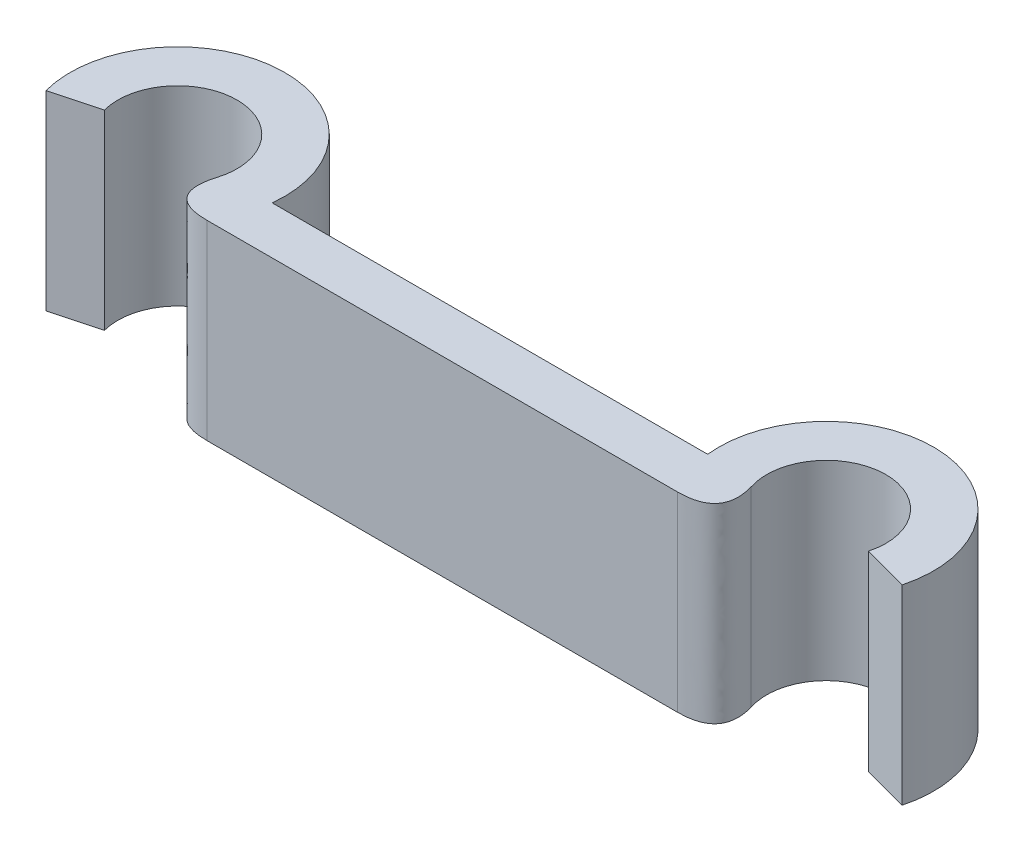
ISO-10303-21;
HEADER;
FILE_DESCRIPTION(('STEP AP214'),'2;1');
FILE_NAME('part.step','',(''),(''),'','','');
FILE_SCHEMA(('AUTOMOTIVE_DESIGN { 1 0 10303 214 1 1 1 1 }'));
ENDSEC;
DATA;
#1=APPLICATION_CONTEXT('core data for automotive mechanical design processes');
#2=APPLICATION_PROTOCOL_DEFINITION('international standard','automotive_design',2000,#1);
#3=PRODUCT_CONTEXT('',#1,'mechanical');
#4=PRODUCT('Part','Part','',(#3));
#5=PRODUCT_RELATED_PRODUCT_CATEGORY('part','',(#4));
#6=PRODUCT_DEFINITION_FORMATION('','',#4);
#7=PRODUCT_DEFINITION_CONTEXT('part definition',#1,'design');
#8=PRODUCT_DEFINITION('design','',#6,#7);
#9=PRODUCT_DEFINITION_SHAPE('','',#8);
#10=(LENGTH_UNIT() NAMED_UNIT(*) SI_UNIT(.MILLI.,.METRE.));
#11=(NAMED_UNIT(*) PLANE_ANGLE_UNIT() SI_UNIT($,.RADIAN.));
#12=(NAMED_UNIT(*) SI_UNIT($,.STERADIAN.) SOLID_ANGLE_UNIT());
#13=UNCERTAINTY_MEASURE_WITH_UNIT(LENGTH_MEASURE(1.E-05),#10,'distance_accuracy_value','');
#14=(GEOMETRIC_REPRESENTATION_CONTEXT(3) GLOBAL_UNCERTAINTY_ASSIGNED_CONTEXT((#13)) GLOBAL_UNIT_ASSIGNED_CONTEXT((#10,
#11,#12)) REPRESENTATION_CONTEXT('',''));
#15=CARTESIAN_POINT('',(0.,0.,0.));
#16=DIRECTION('',(0.,0.,1.));
#17=DIRECTION('',(1.,0.,0.));
#18=AXIS2_PLACEMENT_3D('',#15,#16,#17);
#19=CARTESIAN_POINT('',(0.,10.,0.625));
#20=DIRECTION('',(0.,0.,1.));
#21=DIRECTION('',(1.,0.,0.));
#22=AXIS2_PLACEMENT_3D('',#19,#20,#21);
#23=PLANE('',#22);
#24=DIRECTION('',(-1.,0.,0.));
#25=VECTOR('',#24,1.);
#26=CARTESIAN_POINT('',(0.,0.,0.625));
#27=LINE('',#26,#25);
#28=CARTESIAN_POINT('',(11.4098300562505,0.,0.625000000000001));
#29=VERTEX_POINT('',#28);
#30=CARTESIAN_POINT('',(-11.4098300562505,0.,0.625000000000001));
#31=VERTEX_POINT('',#30);
#32=EDGE_CURVE('E141',#29,#31,#27,.T.);
#33=ORIENTED_EDGE('',*,*,#32,.T.);
#34=DIRECTION('',(0.,-1.,0.));
#35=VECTOR('',#34,1.);
#36=CARTESIAN_POINT('',(-11.4098300562505,10.,0.625000000000001));
#37=LINE('',#36,#35);
#38=CARTESIAN_POINT('',(-11.4098300562505,10.,0.625000000000001));
#39=VERTEX_POINT('',#38);
#40=EDGE_CURVE('E11',#39,#31,#37,.T.);
#41=ORIENTED_EDGE('',*,*,#40,.F.);
#42=DIRECTION('',(-1.,0.,0.));
#43=VECTOR('',#42,1.);
#44=CARTESIAN_POINT('',(0.,10.,0.625));
#45=LINE('',#44,#43);
#46=CARTESIAN_POINT('',(11.4098300562505,10.,0.625000000000001));
#47=VERTEX_POINT('',#46);
#48=EDGE_CURVE('E159',#47,#39,#45,.T.);
#49=ORIENTED_EDGE('',*,*,#48,.F.);
#50=DIRECTION('',(0.,-1.,0.));
#51=VECTOR('',#50,1.);
#52=CARTESIAN_POINT('',(11.4098300562505,10.,0.625000000000001));
#53=LINE('',#52,#51);
#54=EDGE_CURVE('E206',#47,#29,#53,.T.);
#55=ORIENTED_EDGE('',*,*,#54,.T.);
#56=EDGE_LOOP('',(#33,#41,#49,#55));
#57=FACE_BOUND('',#56,.T.);
#58=ADVANCED_FACE('F34',(#57),#23,.F.);
#59=CARTESIAN_POINT('',(-17.,10.,0.));
#60=DIRECTION('',(0.,-1.,0.));
#61=DIRECTION('',(0.,0.,-1.));
#62=AXIS2_PLACEMENT_3D('',#59,#60,#61);
#63=CYLINDRICAL_SURFACE('',#62,5.625);
#64=CARTESIAN_POINT('',(-17.,0.,0.));
#65=DIRECTION('',(0.,1.,0.));
#66=DIRECTION('',(0.,0.,1.));
#67=AXIS2_PLACEMENT_3D('',#64,#65,#66);
#68=CIRCLE('',#67,5.625);
#69=CARTESIAN_POINT('',(-22.433332772876,0.,1.45585712870164));
#70=VERTEX_POINT('',#69);
#71=EDGE_CURVE('E136',#31,#70,#68,.T.);
#72=ORIENTED_EDGE('',*,*,#71,.T.);
#73=DIRECTION('',(0.,-1.,0.));
#74=VECTOR('',#73,1.);
#75=CARTESIAN_POINT('',(-22.433332772876,10.,1.45585712870164));
#76=LINE('',#75,#74);
#77=CARTESIAN_POINT('',(-22.433332772876,10.,1.45585712870164));
#78=VERTEX_POINT('',#77);
#79=EDGE_CURVE('E42',#78,#70,#76,.T.);
#80=ORIENTED_EDGE('',*,*,#79,.F.);
#81=CARTESIAN_POINT('',(-17.,10.,0.));
#82=DIRECTION('',(0.,1.,0.));
#83=DIRECTION('',(0.,0.,1.));
#84=AXIS2_PLACEMENT_3D('',#81,#82,#83);
#85=CIRCLE('',#84,5.625);
#86=EDGE_CURVE('E80',#39,#78,#85,.T.);
#87=ORIENTED_EDGE('',*,*,#86,.F.);
#88=ORIENTED_EDGE('',*,*,#40,.T.);
#89=EDGE_LOOP('',(#72,#80,#87,#88));
#90=FACE_BOUND('',#89,.T.);
#91=ADVANCED_FACE('F129',(#90),#63,.T.);
#92=CARTESIAN_POINT('',(-1.13878406783222,10.,-4.24999999999991));
#93=DIRECTION('',(0.258819045102515,0.,0.96592582628907));
#94=DIRECTION('',(0.96592582628907,0.,-0.258819045102515));
#95=AXIS2_PLACEMENT_3D('',#92,#93,#94);
#96=PLANE('',#95);
#97=DIRECTION('',(-0.96592582628907,0.,0.258819045102515));
#98=VECTOR('',#97,1.);
#99=CARTESIAN_POINT('',(-1.13878406783222,0.,-4.24999999999991));
#100=LINE('',#99,#98);
#101=CARTESIAN_POINT('',(-20.0185182071533,0.,0.808809515945358));
#102=VERTEX_POINT('',#101);
#103=EDGE_CURVE('E95',#102,#70,#100,.T.);
#104=ORIENTED_EDGE('',*,*,#103,.F.);
#105=DIRECTION('',(0.,-1.,0.));
#106=VECTOR('',#105,1.);
#107=CARTESIAN_POINT('',(-20.0185182071533,10.,0.808809515945358));
#108=LINE('',#107,#106);
#109=CARTESIAN_POINT('',(-20.0185182071533,10.,0.808809515945358));
#110=VERTEX_POINT('',#109);
#111=EDGE_CURVE('E90',#110,#102,#108,.T.);
#112=ORIENTED_EDGE('',*,*,#111,.F.);
#113=DIRECTION('',(-0.96592582628907,0.,0.258819045102515));
#114=VECTOR('',#113,1.);
#115=CARTESIAN_POINT('',(-1.13878406783222,10.,-4.24999999999991));
#116=LINE('',#115,#114);
#117=EDGE_CURVE('E93',#110,#78,#116,.T.);
#118=ORIENTED_EDGE('',*,*,#117,.T.);
#119=ORIENTED_EDGE('',*,*,#79,.T.);
#120=EDGE_LOOP('',(#104,#112,#118,#119));
#121=FACE_BOUND('',#120,.T.);
#122=ADVANCED_FACE('F92',(#121),#96,.T.);
#123=CARTESIAN_POINT('',(-17.,10.,0.));
#124=DIRECTION('',(0.,-1.,0.));
#125=DIRECTION('',(0.,0.,-1.));
#126=AXIS2_PLACEMENT_3D('',#123,#124,#125);
#127=CYLINDRICAL_SURFACE('',#126,3.125);
#128=CARTESIAN_POINT('',(-17.,0.,0.));
#129=DIRECTION('',(0.,1.,0.));
#130=DIRECTION('',(0.,0.,1.));
#131=AXIS2_PLACEMENT_3D('',#128,#129,#130);
#132=CIRCLE('',#131,3.125);
#133=CARTESIAN_POINT('',(-14.0294318781231,0.,0.970231948190054));
#134=VERTEX_POINT('',#133);
#135=EDGE_CURVE('E145',#134,#102,#132,.T.);
#136=ORIENTED_EDGE('',*,*,#135,.F.);
#137=DIRECTION('',(0.,-1.,0.));
#138=VECTOR('',#137,1.);
#139=CARTESIAN_POINT('',(-14.0294318781231,10.,0.970231948190054));
#140=LINE('',#139,#138);
#141=CARTESIAN_POINT('',(-14.0294318781231,10.,0.970231948190054));
#142=VERTEX_POINT('',#141);
#143=EDGE_CURVE('E68',#142,#134,#140,.T.);
#144=ORIENTED_EDGE('',*,*,#143,.F.);
#145=CARTESIAN_POINT('',(-17.,10.,0.));
#146=DIRECTION('',(0.,1.,0.));
#147=DIRECTION('',(0.,0.,1.));
#148=AXIS2_PLACEMENT_3D('',#145,#146,#147);
#149=CIRCLE('',#148,3.125);
#150=EDGE_CURVE('E103',#142,#110,#149,.T.);
#151=ORIENTED_EDGE('',*,*,#150,.T.);
#152=ORIENTED_EDGE('',*,*,#111,.T.);
#153=EDGE_LOOP('',(#136,#144,#151,#152));
#154=FACE_BOUND('',#153,.T.);
#155=ADVANCED_FACE('F105',(#154),#127,.F.);
#156=CARTESIAN_POINT('',(-12.3229282665326,10.,3.125));
#157=CARTESIAN_POINT('',(-14.7142969629127,10.,3.13091486922471));
#158=CARTESIAN_POINT('',(-13.9814817928467,10.,0.808809515945357));
#159=B_SPLINE_CURVE_WITH_KNOTS('',2,(#156,#157,#158),.UNSPECIFIED.,.F.,.F.,(3,3),(0.,1.),.UNSPECIFIED.);
#160=DIRECTION('',(0.,-1.,0.));
#161=VECTOR('',#160,1.);
#162=SURFACE_OF_LINEAR_EXTRUSION('',#159,#161);
#163=CARTESIAN_POINT('',(-12.3229282665326,0.,3.125));
#164=CARTESIAN_POINT('',(-14.7142969629127,0.,3.13091486922471));
#165=CARTESIAN_POINT('',(-13.9814817928467,0.,0.808809515945357));
#166=B_SPLINE_CURVE_WITH_KNOTS('',2,(#163,#164,#165),.UNSPECIFIED.,.F.,.F.,(3,3),(0.,1.),.UNSPECIFIED.);
#167=CARTESIAN_POINT('',(-12.3229282665326,0.,3.125));
#168=VERTEX_POINT('',#167);
#169=EDGE_CURVE('E147',#168,#134,#166,.T.);
#170=ORIENTED_EDGE('',*,*,#169,.F.);
#171=DIRECTION('',(0.,-1.,0.));
#172=VECTOR('',#171,1.);
#173=CARTESIAN_POINT('',(-12.3229282665326,10.,3.125));
#174=LINE('',#173,#172);
#175=CARTESIAN_POINT('',(-12.3229282665326,10.,3.125));
#176=VERTEX_POINT('',#175);
#177=EDGE_CURVE('E50',#176,#168,#174,.T.);
#178=ORIENTED_EDGE('',*,*,#177,.F.);
#179=EDGE_CURVE('E106',#176,#142,#159,.T.);
#180=ORIENTED_EDGE('',*,*,#179,.T.);
#181=ORIENTED_EDGE('',*,*,#143,.T.);
#182=EDGE_LOOP('',(#170,#178,#180,#181));
#183=FACE_BOUND('',#182,.T.);
#184=ADVANCED_FACE('F120',(#183),#162,.T.);
#185=CARTESIAN_POINT('',(0.,10.,3.125));
#186=DIRECTION('',(0.,0.,1.));
#187=DIRECTION('',(1.,0.,0.));
#188=AXIS2_PLACEMENT_3D('',#185,#186,#187);
#189=PLANE('',#188);
#190=DIRECTION('',(-1.,0.,0.));
#191=VECTOR('',#190,1.);
#192=CARTESIAN_POINT('',(0.,0.,3.125));
#193=LINE('',#192,#191);
#194=CARTESIAN_POINT('',(12.3229282665326,0.,3.125));
#195=VERTEX_POINT('',#194);
#196=EDGE_CURVE('E153',#195,#168,#193,.T.);
#197=ORIENTED_EDGE('',*,*,#196,.F.);
#198=DIRECTION('',(0.,-1.,0.));
#199=VECTOR('',#198,1.);
#200=CARTESIAN_POINT('',(12.3229282665326,10.,3.125));
#201=LINE('',#200,#199);
#202=CARTESIAN_POINT('',(12.3229282665326,10.,3.125));
#203=VERTEX_POINT('',#202);
#204=EDGE_CURVE('E165',#203,#195,#201,.T.);
#205=ORIENTED_EDGE('',*,*,#204,.F.);
#206=DIRECTION('',(-1.,0.,0.));
#207=VECTOR('',#206,1.);
#208=CARTESIAN_POINT('',(0.,10.,3.125));
#209=LINE('',#208,#207);
#210=EDGE_CURVE('E108',#203,#176,#209,.T.);
#211=ORIENTED_EDGE('',*,*,#210,.T.);
#212=ORIENTED_EDGE('',*,*,#177,.T.);
#213=EDGE_LOOP('',(#197,#205,#211,#212));
#214=FACE_BOUND('',#213,.T.);
#215=ADVANCED_FACE('F124',(#214),#189,.T.);
#216=CARTESIAN_POINT('',(0.,10.,0.));
#217=DIRECTION('',(0.,1.,0.));
#218=DIRECTION('',(0.,0.,1.));
#219=AXIS2_PLACEMENT_3D('',#216,#217,#218);
#220=PLANE('',#219);
#221=ORIENTED_EDGE('',*,*,#48,.T.);
#222=ORIENTED_EDGE('',*,*,#86,.T.);
#223=ORIENTED_EDGE('',*,*,#117,.F.);
#224=ORIENTED_EDGE('',*,*,#150,.F.);
#225=ORIENTED_EDGE('',*,*,#179,.F.);
#226=ORIENTED_EDGE('',*,*,#210,.F.);
#227=CARTESIAN_POINT('',(12.3229282665326,10.,3.125));
#228=CARTESIAN_POINT('',(14.7142969629127,10.,3.13091486922471));
#229=CARTESIAN_POINT('',(13.9814817928467,10.,0.808809515945357));
#230=B_SPLINE_CURVE_WITH_KNOTS('',2,(#227,#228,#229),.UNSPECIFIED.,.F.,.F.,(3,3),(0.,1.),.UNSPECIFIED.);
#231=CARTESIAN_POINT('',(14.0294318781231,10.,0.970231948190054));
#232=VERTEX_POINT('',#231);
#233=EDGE_CURVE('E170',#203,#232,#230,.T.);
#234=ORIENTED_EDGE('',*,*,#233,.T.);
#235=CARTESIAN_POINT('',(17.,10.,0.));
#236=DIRECTION('',(0.,-1.,0.));
#237=DIRECTION('',(0.,0.,1.));
#238=AXIS2_PLACEMENT_3D('',#235,#236,#237);
#239=CIRCLE('',#238,3.125);
#240=CARTESIAN_POINT('',(20.0185182071533,10.,0.808809515945358));
#241=VERTEX_POINT('',#240);
#242=EDGE_CURVE('E218',#232,#241,#239,.T.);
#243=ORIENTED_EDGE('',*,*,#242,.T.);
#244=DIRECTION('',(0.96592582628907,0.,0.258819045102515));
#245=VECTOR('',#244,1.);
#246=CARTESIAN_POINT('',(1.13878406783222,10.,-4.24999999999991));
#247=LINE('',#246,#245);
#248=CARTESIAN_POINT('',(22.433332772876,10.,1.45585712870164));
#249=VERTEX_POINT('',#248);
#250=EDGE_CURVE('E228',#241,#249,#247,.T.);
#251=ORIENTED_EDGE('',*,*,#250,.T.);
#252=CARTESIAN_POINT('',(17.,10.,0.));
#253=DIRECTION('',(0.,-1.,0.));
#254=DIRECTION('',(0.,0.,1.));
#255=AXIS2_PLACEMENT_3D('',#252,#253,#254);
#256=CIRCLE('',#255,5.625);
#257=EDGE_CURVE('E202',#47,#249,#256,.T.);
#258=ORIENTED_EDGE('',*,*,#257,.F.);
#259=EDGE_LOOP('',(#221,#222,#223,#224,#225,#226,#234,#243,#251,#258));
#260=FACE_BOUND('',#259,.T.);
#261=ADVANCED_FACE('F102',(#260),#220,.T.);
#262=CARTESIAN_POINT('',(0.,0.,0.));
#263=DIRECTION('',(0.,1.,0.));
#264=DIRECTION('',(0.,0.,1.));
#265=AXIS2_PLACEMENT_3D('',#262,#263,#264);
#266=PLANE('',#265);
#267=ORIENTED_EDGE('',*,*,#32,.F.);
#268=CARTESIAN_POINT('',(17.,0.,0.));
#269=DIRECTION('',(0.,-1.,0.));
#270=DIRECTION('',(0.,0.,1.));
#271=AXIS2_PLACEMENT_3D('',#268,#269,#270);
#272=CIRCLE('',#271,5.625);
#273=CARTESIAN_POINT('',(22.433332772876,0.,1.45585712870164));
#274=VERTEX_POINT('',#273);
#275=EDGE_CURVE('E200',#29,#274,#272,.T.);
#276=ORIENTED_EDGE('',*,*,#275,.T.);
#277=DIRECTION('',(0.96592582628907,0.,0.258819045102515));
#278=VECTOR('',#277,1.);
#279=CARTESIAN_POINT('',(1.13878406783222,0.,-4.24999999999991));
#280=LINE('',#279,#278);
#281=CARTESIAN_POINT('',(20.0185182071533,0.,0.808809515945358));
#282=VERTEX_POINT('',#281);
#283=EDGE_CURVE('E210',#282,#274,#280,.T.);
#284=ORIENTED_EDGE('',*,*,#283,.F.);
#285=CARTESIAN_POINT('',(17.,0.,0.));
#286=DIRECTION('',(0.,-1.,0.));
#287=DIRECTION('',(0.,0.,1.));
#288=AXIS2_PLACEMENT_3D('',#285,#286,#287);
#289=CIRCLE('',#288,3.125);
#290=CARTESIAN_POINT('',(14.0294318781231,0.,0.970231948190054));
#291=VERTEX_POINT('',#290);
#292=EDGE_CURVE('E214',#291,#282,#289,.T.);
#293=ORIENTED_EDGE('',*,*,#292,.F.);
#294=CARTESIAN_POINT('',(12.3229282665326,0.,3.125));
#295=CARTESIAN_POINT('',(14.7142969629127,0.,3.13091486922471));
#296=CARTESIAN_POINT('',(13.9814817928467,0.,0.808809515945357));
#297=B_SPLINE_CURVE_WITH_KNOTS('',2,(#294,#295,#296),.UNSPECIFIED.,.F.,.F.,(3,3),(0.,1.),.UNSPECIFIED.);
#298=EDGE_CURVE('E233',#195,#291,#297,.T.);
#299=ORIENTED_EDGE('',*,*,#298,.F.);
#300=ORIENTED_EDGE('',*,*,#196,.T.);
#301=ORIENTED_EDGE('',*,*,#169,.T.);
#302=ORIENTED_EDGE('',*,*,#135,.T.);
#303=ORIENTED_EDGE('',*,*,#103,.T.);
#304=ORIENTED_EDGE('',*,*,#71,.F.);
#305=EDGE_LOOP('',(#267,#276,#284,#293,#299,#300,#301,#302,#303,#304));
#306=FACE_BOUND('',#305,.T.);
#307=ADVANCED_FACE('F143',(#306),#266,.F.);
#308=DIRECTION('',(0.,-1.,0.));
#309=VECTOR('',#308,1.);
#310=SURFACE_OF_LINEAR_EXTRUSION('',#230,#309);
#311=ORIENTED_EDGE('',*,*,#298,.T.);
#312=DIRECTION('',(0.,-1.,0.));
#313=VECTOR('',#312,1.);
#314=CARTESIAN_POINT('',(14.0294318781231,10.,0.970231948190054));
#315=LINE('',#314,#313);
#316=EDGE_CURVE('E224',#232,#291,#315,.T.);
#317=ORIENTED_EDGE('',*,*,#316,.F.);
#318=ORIENTED_EDGE('',*,*,#233,.F.);
#319=ORIENTED_EDGE('',*,*,#204,.T.);
#320=EDGE_LOOP('',(#311,#317,#318,#319));
#321=FACE_BOUND('',#320,.T.);
#322=ADVANCED_FACE('F244',(#321),#310,.F.);
#323=CARTESIAN_POINT('',(17.,10.,0.));
#324=DIRECTION('',(0.,-1.,0.));
#325=DIRECTION('',(0.,0.,-1.));
#326=AXIS2_PLACEMENT_3D('',#323,#324,#325);
#327=CYLINDRICAL_SURFACE('',#326,3.125);
#328=ORIENTED_EDGE('',*,*,#292,.T.);
#329=DIRECTION('',(0.,-1.,0.));
#330=VECTOR('',#329,1.);
#331=CARTESIAN_POINT('',(20.0185182071533,10.,0.808809515945358));
#332=LINE('',#331,#330);
#333=EDGE_CURVE('E205',#241,#282,#332,.T.);
#334=ORIENTED_EDGE('',*,*,#333,.F.);
#335=ORIENTED_EDGE('',*,*,#242,.F.);
#336=ORIENTED_EDGE('',*,*,#316,.T.);
#337=EDGE_LOOP('',(#328,#334,#335,#336));
#338=FACE_BOUND('',#337,.T.);
#339=ADVANCED_FACE('F240',(#338),#327,.F.);
#340=CARTESIAN_POINT('',(1.13878406783222,10.,-4.24999999999991));
#341=DIRECTION('',(0.258819045102515,0.,-0.96592582628907));
#342=DIRECTION('',(-0.96592582628907,0.,-0.258819045102515));
#343=AXIS2_PLACEMENT_3D('',#340,#341,#342);
#344=PLANE('',#343);
#345=ORIENTED_EDGE('',*,*,#283,.T.);
#346=DIRECTION('',(0.,-1.,0.));
#347=VECTOR('',#346,1.);
#348=CARTESIAN_POINT('',(22.433332772876,10.,1.45585712870164));
#349=LINE('',#348,#347);
#350=EDGE_CURVE('E195',#249,#274,#349,.T.);
#351=ORIENTED_EDGE('',*,*,#350,.F.);
#352=ORIENTED_EDGE('',*,*,#250,.F.);
#353=ORIENTED_EDGE('',*,*,#333,.T.);
#354=EDGE_LOOP('',(#345,#351,#352,#353));
#355=FACE_BOUND('',#354,.T.);
#356=ADVANCED_FACE('F211',(#355),#344,.F.);
#357=CARTESIAN_POINT('',(17.,10.,0.));
#358=DIRECTION('',(0.,-1.,0.));
#359=DIRECTION('',(0.,0.,-1.));
#360=AXIS2_PLACEMENT_3D('',#357,#358,#359);
#361=CYLINDRICAL_SURFACE('',#360,5.625);
#362=ORIENTED_EDGE('',*,*,#275,.F.);
#363=ORIENTED_EDGE('',*,*,#54,.F.);
#364=ORIENTED_EDGE('',*,*,#257,.T.);
#365=ORIENTED_EDGE('',*,*,#350,.T.);
#366=EDGE_LOOP('',(#362,#363,#364,#365));
#367=FACE_BOUND('',#366,.T.);
#368=ADVANCED_FACE('F197',(#367),#361,.T.);
#369=CLOSED_SHELL('',(#58,#91,#122,#155,#184,#215,#261,#307,#322,#339,#356,#368));
#370=MANIFOLD_SOLID_BREP('B2',#369);
#371=ADVANCED_BREP_SHAPE_REPRESENTATION('',(#18,#370),#14);
#372=SHAPE_DEFINITION_REPRESENTATION(#9,#371);
ENDSEC;
END-ISO-10303-21;
